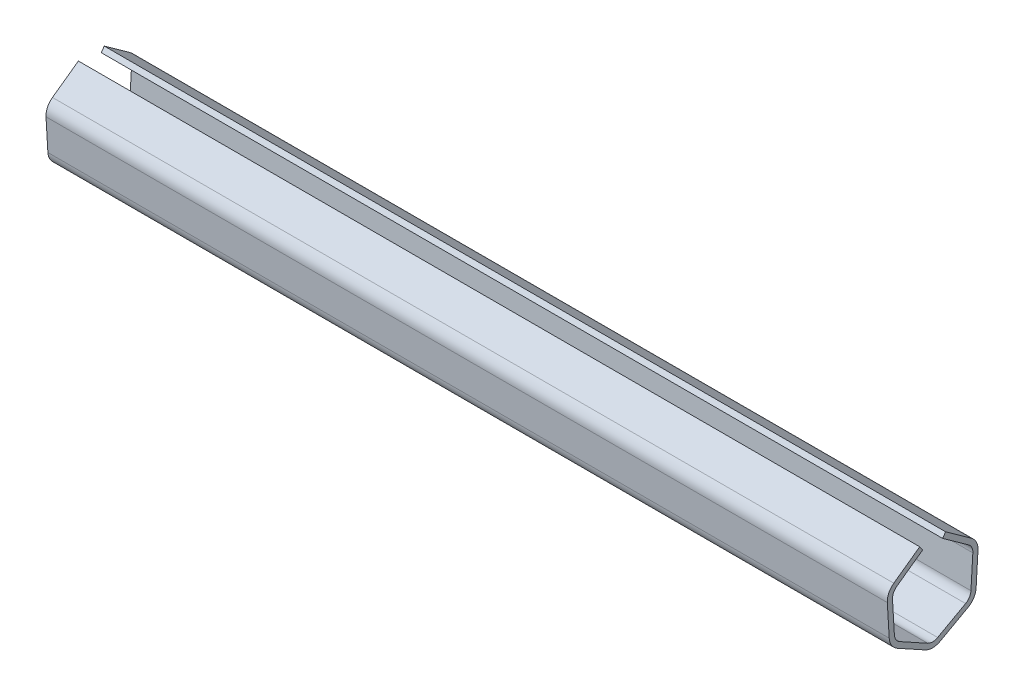
ISO-10303-21;
HEADER;
FILE_DESCRIPTION(('STEP AP214'),'2;1');
FILE_NAME('part.step','',(''),(''),'','','');
FILE_SCHEMA(('AUTOMOTIVE_DESIGN { 1 0 10303 214 1 1 1 1 }'));
ENDSEC;
DATA;
#1=APPLICATION_CONTEXT('core data for automotive mechanical design processes');
#2=APPLICATION_PROTOCOL_DEFINITION('international standard','automotive_design',2000,#1);
#3=PRODUCT_CONTEXT('',#1,'mechanical');
#4=PRODUCT('Part','Part','',(#3));
#5=PRODUCT_RELATED_PRODUCT_CATEGORY('part','',(#4));
#6=PRODUCT_DEFINITION_FORMATION('','',#4);
#7=PRODUCT_DEFINITION_CONTEXT('part definition',#1,'design');
#8=PRODUCT_DEFINITION('design','',#6,#7);
#9=PRODUCT_DEFINITION_SHAPE('','',#8);
#10=(LENGTH_UNIT() NAMED_UNIT(*) SI_UNIT(.MILLI.,.METRE.));
#11=(NAMED_UNIT(*) PLANE_ANGLE_UNIT() SI_UNIT($,.RADIAN.));
#12=(NAMED_UNIT(*) SI_UNIT($,.STERADIAN.) SOLID_ANGLE_UNIT());
#13=UNCERTAINTY_MEASURE_WITH_UNIT(LENGTH_MEASURE(1.E-05),#10,'distance_accuracy_value','');
#14=(GEOMETRIC_REPRESENTATION_CONTEXT(3) GLOBAL_UNCERTAINTY_ASSIGNED_CONTEXT((#13)) GLOBAL_UNIT_ASSIGNED_CONTEXT((#10,
#11,#12)) REPRESENTATION_CONTEXT('',''));
#15=CARTESIAN_POINT('',(0.,0.,0.));
#16=DIRECTION('',(0.,0.,1.));
#17=DIRECTION('',(1.,0.,0.));
#18=AXIS2_PLACEMENT_3D('',#15,#16,#17);
#19=CARTESIAN_POINT('',(325.,22.1288571064017,-30.0339216678259));
#20=DIRECTION('',(0.,-0.812701903756913,0.58267968527304));
#21=DIRECTION('',(0.,-0.582679685273041,-0.812701903756913));
#22=AXIS2_PLACEMENT_3D('',#19,#20,#21);
#23=PLANE('',#22);
#24=DIRECTION('',(0.,0.58267968527304,0.812701903756913));
#25=VECTOR('',#24,1.);
#26=CARTESIAN_POINT('',(-325.,22.1288571064017,-30.0339216678259));
#27=LINE('',#26,#25);
#28=CARTESIAN_POINT('',(-325.,22.1288571064017,-30.0339216678259));
#29=VERTEX_POINT('',#28);
#30=CARTESIAN_POINT('',(-325.,36.4924990742999,-10.));
#31=VERTEX_POINT('',#30);
#32=EDGE_CURVE('E228',#29,#31,#27,.T.);
#33=ORIENTED_EDGE('',*,*,#32,.T.);
#34=DIRECTION('',(-1.,0.,0.));
#35=VECTOR('',#34,1.);
#36=CARTESIAN_POINT('',(325.,36.4924990742999,-10.));
#37=LINE('',#36,#35);
#38=CARTESIAN_POINT('',(325.,36.4924990742999,-10.));
#39=VERTEX_POINT('',#38);
#40=EDGE_CURVE('E11',#39,#31,#37,.T.);
#41=ORIENTED_EDGE('',*,*,#40,.F.);
#42=DIRECTION('',(0.,0.58267968527304,0.812701903756913));
#43=VECTOR('',#42,1.);
#44=CARTESIAN_POINT('',(325.,22.1288571064017,-30.0339216678259));
#45=LINE('',#44,#43);
#46=CARTESIAN_POINT('',(325.,22.1288571064017,-30.0339216678259));
#47=VERTEX_POINT('',#46);
#48=EDGE_CURVE('E141',#47,#39,#45,.T.);
#49=ORIENTED_EDGE('',*,*,#48,.F.);
#50=DIRECTION('',(-1.,0.,0.));
#51=VECTOR('',#50,1.);
#52=CARTESIAN_POINT('',(325.,22.1288571064017,-30.0339216678259));
#53=LINE('',#52,#51);
#54=EDGE_CURVE('E224',#47,#29,#53,.T.);
#55=ORIENTED_EDGE('',*,*,#54,.T.);
#56=EDGE_LOOP('',(#33,#41,#49,#55));
#57=FACE_BOUND('',#56,.T.);
#58=ADVANCED_FACE('F37',(#57),#23,.F.);
#59=CARTESIAN_POINT('',(325.,33.2416914592723,-7.66928125890783));
#60=DIRECTION('',(0.,0.582679685273042,0.812701903756912));
#61=DIRECTION('',(0.,-0.812701903756912,0.582679685273042));
#62=AXIS2_PLACEMENT_3D('',#59,#60,#61);
#63=PLANE('',#62);
#64=DIRECTION('',(0.,0.812701903756912,-0.582679685273042));
#65=VECTOR('',#64,1.);
#66=CARTESIAN_POINT('',(-325.,33.2416914592723,-7.66928125890783));
#67=LINE('',#66,#65);
#68=CARTESIAN_POINT('',(-325.,33.2416914592723,-7.66928125890783));
#69=VERTEX_POINT('',#68);
#70=EDGE_CURVE('E231',#69,#31,#67,.T.);
#71=ORIENTED_EDGE('',*,*,#70,.F.);
#72=DIRECTION('',(-1.,0.,0.));
#73=VECTOR('',#72,1.);
#74=CARTESIAN_POINT('',(325.,33.2416914592723,-7.66928125890783));
#75=LINE('',#74,#73);
#76=CARTESIAN_POINT('',(325.,33.2416914592723,-7.66928125890783));
#77=VERTEX_POINT('',#76);
#78=EDGE_CURVE('E45',#77,#69,#75,.T.);
#79=ORIENTED_EDGE('',*,*,#78,.F.);
#80=DIRECTION('',(0.,0.812701903756912,-0.582679685273042));
#81=VECTOR('',#80,1.);
#82=CARTESIAN_POINT('',(325.,33.2416914592723,-7.66928125890783));
#83=LINE('',#82,#81);
#84=EDGE_CURVE('E357',#77,#39,#83,.T.);
#85=ORIENTED_EDGE('',*,*,#84,.T.);
#86=ORIENTED_EDGE('',*,*,#40,.T.);
#87=EDGE_LOOP('',(#71,#79,#85,#86));
#88=FACE_BOUND('',#87,.T.);
#89=ADVANCED_FACE('F344',(#88),#63,.T.);
#90=CARTESIAN_POINT('',(325.,18.8780494913741,-27.7032029267338));
#91=DIRECTION('',(0.,-0.812701903756913,0.58267968527304));
#92=DIRECTION('',(0.,-0.58267968527304,-0.812701903756913));
#93=AXIS2_PLACEMENT_3D('',#90,#91,#92);
#94=PLANE('',#93);
#95=DIRECTION('',(0.,0.58267968527304,0.812701903756913));
#96=VECTOR('',#95,1.);
#97=CARTESIAN_POINT('',(-325.,18.8780494913741,-27.7032029267338));
#98=LINE('',#97,#96);
#99=CARTESIAN_POINT('',(-325.,18.8780494913741,-27.7032029267338));
#100=VERTEX_POINT('',#99);
#101=EDGE_CURVE('E234',#100,#69,#98,.T.);
#102=ORIENTED_EDGE('',*,*,#101,.F.);
#103=DIRECTION('',(-1.,0.,0.));
#104=VECTOR('',#103,1.);
#105=CARTESIAN_POINT('',(325.,18.8780494913741,-27.7032029267338));
#106=LINE('',#105,#104);
#107=CARTESIAN_POINT('',(325.,18.8780494913741,-27.7032029267338));
#108=VERTEX_POINT('',#107);
#109=EDGE_CURVE('E334',#108,#100,#106,.T.);
#110=ORIENTED_EDGE('',*,*,#109,.F.);
#111=DIRECTION('',(0.,0.58267968527304,0.812701903756913));
#112=VECTOR('',#111,1.);
#113=CARTESIAN_POINT('',(325.,18.8780494913741,-27.7032029267338));
#114=LINE('',#113,#112);
#115=EDGE_CURVE('E341',#108,#77,#114,.T.);
#116=ORIENTED_EDGE('',*,*,#115,.T.);
#117=ORIENTED_EDGE('',*,*,#78,.T.);
#118=EDGE_LOOP('',(#102,#110,#116,#117));
#119=FACE_BOUND('',#118,.T.);
#120=ADVANCED_FACE('F339',(#119),#94,.T.);
#121=CARTESIAN_POINT('',(325.,12.3764342613188,-23.0417654445493));
#122=DIRECTION('',(-1.,0.,0.));
#123=DIRECTION('',(0.,0.,1.));
#124=AXIS2_PLACEMENT_3D('',#121,#122,#123);
#125=CYLINDRICAL_SURFACE('',#124,8.00000000000004);
#126=CARTESIAN_POINT('',(-325.,12.3764342613188,-23.0417654445493));
#127=DIRECTION('',(1.,0.,0.));
#128=DIRECTION('',(0.,0.,-1.));
#129=AXIS2_PLACEMENT_3D('',#126,#127,#128);
#130=CIRCLE('',#129,8.00000000000004);
#131=CARTESIAN_POINT('',(-325.,11.9042770236399,-31.0278200112867));
#132=VERTEX_POINT('',#131);
#133=EDGE_CURVE('E237',#132,#100,#130,.T.);
#134=ORIENTED_EDGE('',*,*,#133,.F.);
#135=DIRECTION('',(-1.,0.,0.));
#136=VECTOR('',#135,1.);
#137=CARTESIAN_POINT('',(325.,11.9042770236399,-31.0278200112867));
#138=LINE('',#137,#136);
#139=CARTESIAN_POINT('',(325.,11.9042770236399,-31.0278200112867));
#140=VERTEX_POINT('',#139);
#141=EDGE_CURVE('E332',#140,#132,#138,.T.);
#142=ORIENTED_EDGE('',*,*,#141,.F.);
#143=CARTESIAN_POINT('',(325.,12.3764342613188,-23.0417654445493));
#144=DIRECTION('',(1.,0.,0.));
#145=DIRECTION('',(0.,0.,-1.));
#146=AXIS2_PLACEMENT_3D('',#143,#144,#145);
#147=CIRCLE('',#146,8.00000000000004);
#148=EDGE_CURVE('E354',#140,#108,#147,.T.);
#149=ORIENTED_EDGE('',*,*,#148,.T.);
#150=ORIENTED_EDGE('',*,*,#109,.T.);
#151=EDGE_LOOP('',(#134,#142,#149,#150));
#152=FACE_BOUND('',#151,.T.);
#153=ADVANCED_FACE('F351',(#152),#125,.F.);
#154=CARTESIAN_POINT('',(325.,-12.7037605122333,-29.5729259919006));
#155=DIRECTION('',(0.,0.0590196547098669,0.998256820842176));
#156=DIRECTION('',(0.,-0.998256820842176,0.0590196547098669));
#157=AXIS2_PLACEMENT_3D('',#154,#155,#156);
#158=PLANE('',#157);
#159=DIRECTION('',(0.,0.998256820842176,-0.0590196547098669));
#160=VECTOR('',#159,1.);
#161=CARTESIAN_POINT('',(-325.,-12.7037605122333,-29.5729259919006));
#162=LINE('',#161,#160);
#163=CARTESIAN_POINT('',(-325.,-12.7037605122333,-29.5729259919006));
#164=VERTEX_POINT('',#163);
#165=EDGE_CURVE('E240',#164,#132,#162,.T.);
#166=ORIENTED_EDGE('',*,*,#165,.F.);
#167=DIRECTION('',(-1.,0.,0.));
#168=VECTOR('',#167,1.);
#169=CARTESIAN_POINT('',(325.,-12.7037605122333,-29.5729259919006));
#170=LINE('',#169,#168);
#171=CARTESIAN_POINT('',(325.,-12.7037605122333,-29.5729259919006));
#172=VERTEX_POINT('',#171);
#173=EDGE_CURVE('E330',#172,#164,#170,.T.);
#174=ORIENTED_EDGE('',*,*,#173,.F.);
#175=DIRECTION('',(0.,0.998256820842176,-0.0590196547098669));
#176=VECTOR('',#175,1.);
#177=CARTESIAN_POINT('',(325.,-12.7037605122333,-29.5729259919006));
#178=LINE('',#177,#176);
#179=EDGE_CURVE('E359',#172,#140,#178,.T.);
#180=ORIENTED_EDGE('',*,*,#179,.T.);
#181=ORIENTED_EDGE('',*,*,#141,.T.);
#182=EDGE_LOOP('',(#166,#174,#180,#181));
#183=FACE_BOUND('',#182,.T.);
#184=ADVANCED_FACE('F435',(#183),#158,.T.);
#185=CARTESIAN_POINT('',(325.,-12.231603274554,-21.5868714251633));
#186=DIRECTION('',(-1.,0.,0.));
#187=DIRECTION('',(0.,0.,1.));
#188=AXIS2_PLACEMENT_3D('',#185,#186,#187);
#189=CYLINDRICAL_SURFACE('',#188,7.99999999999995);
#190=CARTESIAN_POINT('',(-325.,-12.231603274554,-21.5868714251633));
#191=DIRECTION('',(1.,0.,0.));
#192=DIRECTION('',(0.,0.,-1.));
#193=AXIS2_PLACEMENT_3D('',#190,#191,#192);
#194=CIRCLE('',#193,7.99999999999995);
#195=CARTESIAN_POINT('',(-325.,-19.2371978033818,-25.4497259781664));
#196=VERTEX_POINT('',#195);
#197=EDGE_CURVE('E243',#196,#164,#194,.T.);
#198=ORIENTED_EDGE('',*,*,#197,.F.);
#199=DIRECTION('',(-1.,0.,0.));
#200=VECTOR('',#199,1.);
#201=CARTESIAN_POINT('',(325.,-19.2371978033818,-25.4497259781664));
#202=LINE('',#201,#200);
#203=CARTESIAN_POINT('',(325.,-19.2371978033818,-25.4497259781664));
#204=VERTEX_POINT('',#203);
#205=EDGE_CURVE('E328',#204,#196,#202,.T.);
#206=ORIENTED_EDGE('',*,*,#205,.F.);
#207=CARTESIAN_POINT('',(325.,-12.231603274554,-21.5868714251633));
#208=DIRECTION('',(1.,0.,0.));
#209=DIRECTION('',(0.,0.,-1.));
#210=AXIS2_PLACEMENT_3D('',#207,#208,#209);
#211=CIRCLE('',#210,7.99999999999995);
#212=EDGE_CURVE('E365',#204,#172,#211,.T.);
#213=ORIENTED_EDGE('',*,*,#212,.T.);
#214=ORIENTED_EDGE('',*,*,#173,.T.);
#215=EDGE_LOOP('',(#198,#206,#213,#214));
#216=FACE_BOUND('',#215,.T.);
#217=ADVANCED_FACE('F438',(#216),#189,.F.);
#218=CARTESIAN_POINT('',(325.,-31.1401054333697,-3.86285455300323));
#219=DIRECTION('',(0.,0.875699316103479,0.4828568191254));
#220=DIRECTION('',(0.,-0.4828568191254,0.875699316103479));
#221=AXIS2_PLACEMENT_3D('',#218,#219,#220);
#222=PLANE('',#221);
#223=DIRECTION('',(0.,0.4828568191254,-0.875699316103479));
#224=VECTOR('',#223,1.);
#225=CARTESIAN_POINT('',(-325.,-31.1401054333697,-3.86285455300323));
#226=LINE('',#225,#224);
#227=CARTESIAN_POINT('',(-325.,-31.1401054333697,-3.86285455300324));
#228=VERTEX_POINT('',#227);
#229=EDGE_CURVE('E246',#228,#196,#226,.T.);
#230=ORIENTED_EDGE('',*,*,#229,.F.);
#231=DIRECTION('',(-1.,0.,0.));
#232=VECTOR('',#231,1.);
#233=CARTESIAN_POINT('',(325.,-31.1401054333697,-3.86285455300324));
#234=LINE('',#233,#232);
#235=CARTESIAN_POINT('',(325.,-31.1401054333697,-3.86285455300324));
#236=VERTEX_POINT('',#235);
#237=EDGE_CURVE('E326',#236,#228,#234,.T.);
#238=ORIENTED_EDGE('',*,*,#237,.F.);
#239=DIRECTION('',(0.,0.4828568191254,-0.875699316103479));
#240=VECTOR('',#239,1.);
#241=CARTESIAN_POINT('',(325.,-31.1401054333697,-3.86285455300323));
#242=LINE('',#241,#240);
#243=EDGE_CURVE('E368',#236,#204,#242,.T.);
#244=ORIENTED_EDGE('',*,*,#243,.T.);
#245=ORIENTED_EDGE('',*,*,#205,.T.);
#246=EDGE_LOOP('',(#230,#238,#244,#245));
#247=FACE_BOUND('',#246,.T.);
#248=ADVANCED_FACE('F442',(#247),#222,.T.);
#249=CARTESIAN_POINT('',(325.,-24.1345109045418,0.));
#250=DIRECTION('',(-1.,0.,0.));
#251=DIRECTION('',(0.,0.,1.));
#252=AXIS2_PLACEMENT_3D('',#249,#250,#251);
#253=CYLINDRICAL_SURFACE('',#252,8.00000000000005);
#254=CARTESIAN_POINT('',(-325.,-24.1345109045418,0.));
#255=DIRECTION('',(1.,0.,0.));
#256=DIRECTION('',(0.,0.,-1.));
#257=AXIS2_PLACEMENT_3D('',#254,#255,#256);
#258=CIRCLE('',#257,8.00000000000005);
#259=CARTESIAN_POINT('',(-325.,-31.1401054333697,3.86285455300324));
#260=VERTEX_POINT('',#259);
#261=EDGE_CURVE('E249',#260,#228,#258,.T.);
#262=ORIENTED_EDGE('',*,*,#261,.F.);
#263=DIRECTION('',(-1.,0.,0.));
#264=VECTOR('',#263,1.);
#265=CARTESIAN_POINT('',(325.,-31.1401054333697,3.86285455300324));
#266=LINE('',#265,#264);
#267=CARTESIAN_POINT('',(325.,-31.1401054333697,3.86285455300324));
#268=VERTEX_POINT('',#267);
#269=EDGE_CURVE('E324',#268,#260,#266,.T.);
#270=ORIENTED_EDGE('',*,*,#269,.F.);
#271=CARTESIAN_POINT('',(325.,-24.1345109045418,0.));
#272=DIRECTION('',(1.,0.,0.));
#273=DIRECTION('',(0.,0.,-1.));
#274=AXIS2_PLACEMENT_3D('',#271,#272,#273);
#275=CIRCLE('',#274,8.00000000000005);
#276=EDGE_CURVE('E371',#268,#236,#275,.T.);
#277=ORIENTED_EDGE('',*,*,#276,.T.);
#278=ORIENTED_EDGE('',*,*,#237,.T.);
#279=EDGE_LOOP('',(#262,#270,#277,#278));
#280=FACE_BOUND('',#279,.T.);
#281=ADVANCED_FACE('F446',(#280),#253,.F.);
#282=CARTESIAN_POINT('',(325.,-31.1401054333697,3.86285455300323));
#283=DIRECTION('',(0.,0.875699316103479,-0.4828568191254));
#284=DIRECTION('',(0.,0.4828568191254,0.875699316103479));
#285=AXIS2_PLACEMENT_3D('',#282,#283,#284);
#286=PLANE('',#285);
#287=DIRECTION('',(0.,-0.4828568191254,-0.875699316103479));
#288=VECTOR('',#287,1.);
#289=CARTESIAN_POINT('',(-325.,-31.1401054333697,3.86285455300323));
#290=LINE('',#289,#288);
#291=CARTESIAN_POINT('',(-325.,-19.2371978033818,25.4497259781665));
#292=VERTEX_POINT('',#291);
#293=EDGE_CURVE('E252',#292,#260,#290,.T.);
#294=ORIENTED_EDGE('',*,*,#293,.F.);
#295=DIRECTION('',(-1.,0.,0.));
#296=VECTOR('',#295,1.);
#297=CARTESIAN_POINT('',(325.,-19.2371978033818,25.4497259781665));
#298=LINE('',#297,#296);
#299=CARTESIAN_POINT('',(325.,-19.2371978033818,25.4497259781665));
#300=VERTEX_POINT('',#299);
#301=EDGE_CURVE('E322',#300,#292,#298,.T.);
#302=ORIENTED_EDGE('',*,*,#301,.F.);
#303=DIRECTION('',(0.,-0.4828568191254,-0.875699316103479));
#304=VECTOR('',#303,1.);
#305=CARTESIAN_POINT('',(325.,-31.1401054333697,3.86285455300323));
#306=LINE('',#305,#304);
#307=EDGE_CURVE('E374',#300,#268,#306,.T.);
#308=ORIENTED_EDGE('',*,*,#307,.T.);
#309=ORIENTED_EDGE('',*,*,#269,.T.);
#310=EDGE_LOOP('',(#294,#302,#308,#309));
#311=FACE_BOUND('',#310,.T.);
#312=ADVANCED_FACE('F450',(#311),#286,.T.);
#313=CARTESIAN_POINT('',(325.,-12.231603274554,21.5868714251633));
#314=DIRECTION('',(-1.,0.,0.));
#315=DIRECTION('',(0.,0.,1.));
#316=AXIS2_PLACEMENT_3D('',#313,#314,#315);
#317=CYLINDRICAL_SURFACE('',#316,7.99999999999995);
#318=CARTESIAN_POINT('',(-325.,-12.231603274554,21.5868714251633));
#319=DIRECTION('',(1.,0.,0.));
#320=DIRECTION('',(0.,0.,-1.));
#321=AXIS2_PLACEMENT_3D('',#318,#319,#320);
#322=CIRCLE('',#321,7.99999999999995);
#323=CARTESIAN_POINT('',(-325.,-12.7037605122332,29.5729259919006));
#324=VERTEX_POINT('',#323);
#325=EDGE_CURVE('E255',#324,#292,#322,.T.);
#326=ORIENTED_EDGE('',*,*,#325,.F.);
#327=DIRECTION('',(-1.,0.,0.));
#328=VECTOR('',#327,1.);
#329=CARTESIAN_POINT('',(325.,-12.7037605122332,29.5729259919006));
#330=LINE('',#329,#328);
#331=CARTESIAN_POINT('',(325.,-12.7037605122332,29.5729259919006));
#332=VERTEX_POINT('',#331);
#333=EDGE_CURVE('E320',#332,#324,#330,.T.);
#334=ORIENTED_EDGE('',*,*,#333,.F.);
#335=CARTESIAN_POINT('',(325.,-12.231603274554,21.5868714251633));
#336=DIRECTION('',(1.,0.,0.));
#337=DIRECTION('',(0.,0.,-1.));
#338=AXIS2_PLACEMENT_3D('',#335,#336,#337);
#339=CIRCLE('',#338,7.99999999999995);
#340=EDGE_CURVE('E377',#332,#300,#339,.T.);
#341=ORIENTED_EDGE('',*,*,#340,.T.);
#342=ORIENTED_EDGE('',*,*,#301,.T.);
#343=EDGE_LOOP('',(#326,#334,#341,#342));
#344=FACE_BOUND('',#343,.T.);
#345=ADVANCED_FACE('F454',(#344),#317,.F.);
#346=CARTESIAN_POINT('',(325.,-12.7037605122333,29.5729259919006));
#347=DIRECTION('',(0.,0.0590196547098669,-0.998256820842176));
#348=DIRECTION('',(0.,0.998256820842176,0.0590196547098669));
#349=AXIS2_PLACEMENT_3D('',#346,#347,#348);
#350=PLANE('',#349);
#351=DIRECTION('',(0.,-0.998256820842176,-0.0590196547098669));
#352=VECTOR('',#351,1.);
#353=CARTESIAN_POINT('',(-325.,-12.7037605122333,29.5729259919006));
#354=LINE('',#353,#352);
#355=CARTESIAN_POINT('',(-325.,11.9042770236399,31.0278200112867));
#356=VERTEX_POINT('',#355);
#357=EDGE_CURVE('E258',#356,#324,#354,.T.);
#358=ORIENTED_EDGE('',*,*,#357,.F.);
#359=DIRECTION('',(-1.,0.,0.));
#360=VECTOR('',#359,1.);
#361=CARTESIAN_POINT('',(325.,11.9042770236399,31.0278200112867));
#362=LINE('',#361,#360);
#363=CARTESIAN_POINT('',(325.,11.9042770236399,31.0278200112867));
#364=VERTEX_POINT('',#363);
#365=EDGE_CURVE('E317',#364,#356,#362,.T.);
#366=ORIENTED_EDGE('',*,*,#365,.F.);
#367=DIRECTION('',(0.,-0.998256820842176,-0.0590196547098669));
#368=VECTOR('',#367,1.);
#369=CARTESIAN_POINT('',(325.,-12.7037605122333,29.5729259919006));
#370=LINE('',#369,#368);
#371=EDGE_CURVE('E380',#364,#332,#370,.T.);
#372=ORIENTED_EDGE('',*,*,#371,.T.);
#373=ORIENTED_EDGE('',*,*,#333,.T.);
#374=EDGE_LOOP('',(#358,#366,#372,#373));
#375=FACE_BOUND('',#374,.T.);
#376=ADVANCED_FACE('F458',(#375),#350,.T.);
#377=CARTESIAN_POINT('',(325.,12.3764342613186,23.0417654445493));
#378=DIRECTION('',(-1.,0.,0.));
#379=DIRECTION('',(0.,0.,1.));
#380=AXIS2_PLACEMENT_3D('',#377,#378,#379);
#381=CYLINDRICAL_SURFACE('',#380,8.00000000000014);
#382=CARTESIAN_POINT('',(-325.,12.3764342613186,23.0417654445493));
#383=DIRECTION('',(1.,0.,0.));
#384=DIRECTION('',(0.,0.,-1.));
#385=AXIS2_PLACEMENT_3D('',#382,#383,#384);
#386=CIRCLE('',#385,8.00000000000014);
#387=CARTESIAN_POINT('',(-325.,18.878049491374,27.7032029267337));
#388=VERTEX_POINT('',#387);
#389=EDGE_CURVE('E261',#388,#356,#386,.T.);
#390=ORIENTED_EDGE('',*,*,#389,.F.);
#391=DIRECTION('',(-1.,0.,0.));
#392=VECTOR('',#391,1.);
#393=CARTESIAN_POINT('',(325.,18.878049491374,27.7032029267337));
#394=LINE('',#393,#392);
#395=CARTESIAN_POINT('',(325.,18.878049491374,27.7032029267337));
#396=VERTEX_POINT('',#395);
#397=EDGE_CURVE('E314',#396,#388,#394,.T.);
#398=ORIENTED_EDGE('',*,*,#397,.F.);
#399=CARTESIAN_POINT('',(325.,12.3764342613186,23.0417654445493));
#400=DIRECTION('',(1.,0.,0.));
#401=DIRECTION('',(0.,0.,-1.));
#402=AXIS2_PLACEMENT_3D('',#399,#400,#401);
#403=CIRCLE('',#402,8.00000000000014);
#404=EDGE_CURVE('E383',#396,#364,#403,.T.);
#405=ORIENTED_EDGE('',*,*,#404,.T.);
#406=ORIENTED_EDGE('',*,*,#365,.T.);
#407=EDGE_LOOP('',(#390,#398,#405,#406));
#408=FACE_BOUND('',#407,.T.);
#409=ADVANCED_FACE('F462',(#408),#381,.F.);
#410=CARTESIAN_POINT('',(325.,18.8780494913741,27.7032029267338));
#411=DIRECTION('',(0.,-0.812701903756913,-0.58267968527304));
#412=DIRECTION('',(0.,0.58267968527304,-0.812701903756913));
#413=AXIS2_PLACEMENT_3D('',#410,#411,#412);
#414=PLANE('',#413);
#415=DIRECTION('',(0.,-0.58267968527304,0.812701903756913));
#416=VECTOR('',#415,1.);
#417=CARTESIAN_POINT('',(-325.,18.8780494913741,27.7032029267338));
#418=LINE('',#417,#416);
#419=CARTESIAN_POINT('',(-325.,33.2416914592723,7.66928125890783));
#420=VERTEX_POINT('',#419);
#421=EDGE_CURVE('E264',#420,#388,#418,.T.);
#422=ORIENTED_EDGE('',*,*,#421,.F.);
#423=DIRECTION('',(-1.,0.,0.));
#424=VECTOR('',#423,1.);
#425=CARTESIAN_POINT('',(325.,33.2416914592723,7.66928125890783));
#426=LINE('',#425,#424);
#427=CARTESIAN_POINT('',(325.,33.2416914592723,7.66928125890783));
#428=VERTEX_POINT('',#427);
#429=EDGE_CURVE('E312',#428,#420,#426,.T.);
#430=ORIENTED_EDGE('',*,*,#429,.F.);
#431=DIRECTION('',(0.,-0.58267968527304,0.812701903756913));
#432=VECTOR('',#431,1.);
#433=CARTESIAN_POINT('',(325.,18.8780494913741,27.7032029267338));
#434=LINE('',#433,#432);
#435=EDGE_CURVE('E386',#428,#396,#434,.T.);
#436=ORIENTED_EDGE('',*,*,#435,.T.);
#437=ORIENTED_EDGE('',*,*,#397,.T.);
#438=EDGE_LOOP('',(#422,#430,#436,#437));
#439=FACE_BOUND('',#438,.T.);
#440=ADVANCED_FACE('F466',(#439),#414,.T.);
#441=CARTESIAN_POINT('',(325.,36.4924990742999,10.));
#442=DIRECTION('',(0.,0.582679685273042,-0.812701903756912));
#443=DIRECTION('',(0.,0.812701903756912,0.582679685273042));
#444=AXIS2_PLACEMENT_3D('',#441,#442,#443);
#445=PLANE('',#444);
#446=DIRECTION('',(0.,-0.812701903756912,-0.582679685273042));
#447=VECTOR('',#446,1.);
#448=CARTESIAN_POINT('',(-325.,36.4924990742999,10.));
#449=LINE('',#448,#447);
#450=CARTESIAN_POINT('',(-325.,36.4924990742999,10.));
#451=VERTEX_POINT('',#450);
#452=EDGE_CURVE('E267',#451,#420,#449,.T.);
#453=ORIENTED_EDGE('',*,*,#452,.F.);
#454=DIRECTION('',(-1.,0.,0.));
#455=VECTOR('',#454,1.);
#456=CARTESIAN_POINT('',(325.,36.4924990742999,10.));
#457=LINE('',#456,#455);
#458=CARTESIAN_POINT('',(325.,36.4924990742999,10.));
#459=VERTEX_POINT('',#458);
#460=EDGE_CURVE('E310',#459,#451,#457,.T.);
#461=ORIENTED_EDGE('',*,*,#460,.F.);
#462=DIRECTION('',(0.,-0.812701903756912,-0.582679685273042));
#463=VECTOR('',#462,1.);
#464=CARTESIAN_POINT('',(325.,36.4924990742999,10.));
#465=LINE('',#464,#463);
#466=EDGE_CURVE('E389',#459,#428,#465,.T.);
#467=ORIENTED_EDGE('',*,*,#466,.T.);
#468=ORIENTED_EDGE('',*,*,#429,.T.);
#469=EDGE_LOOP('',(#453,#461,#467,#468));
#470=FACE_BOUND('',#469,.T.);
#471=ADVANCED_FACE('F470',(#470),#445,.T.);
#472=CARTESIAN_POINT('',(325.,22.1288571064017,30.0339216678259));
#473=DIRECTION('',(0.,-0.812701903756913,-0.58267968527304));
#474=DIRECTION('',(0.,0.582679685273041,-0.812701903756913));
#475=AXIS2_PLACEMENT_3D('',#472,#473,#474);
#476=PLANE('',#475);
#477=DIRECTION('',(0.,-0.58267968527304,0.812701903756913));
#478=VECTOR('',#477,1.);
#479=CARTESIAN_POINT('',(-325.,22.1288571064017,30.0339216678259));
#480=LINE('',#479,#478);
#481=CARTESIAN_POINT('',(-325.,22.1288571064017,30.0339216678259));
#482=VERTEX_POINT('',#481);
#483=EDGE_CURVE('E270',#451,#482,#480,.T.);
#484=ORIENTED_EDGE('',*,*,#483,.T.);
#485=DIRECTION('',(-1.,0.,0.));
#486=VECTOR('',#485,1.);
#487=CARTESIAN_POINT('',(325.,22.1288571064017,30.0339216678259));
#488=LINE('',#487,#486);
#489=CARTESIAN_POINT('',(325.,22.1288571064017,30.0339216678259));
#490=VERTEX_POINT('',#489);
#491=EDGE_CURVE('E306',#490,#482,#488,.T.);
#492=ORIENTED_EDGE('',*,*,#491,.F.);
#493=DIRECTION('',(0.,-0.58267968527304,0.812701903756913));
#494=VECTOR('',#493,1.);
#495=CARTESIAN_POINT('',(325.,22.1288571064017,30.0339216678259));
#496=LINE('',#495,#494);
#497=EDGE_CURVE('E392',#459,#490,#496,.T.);
#498=ORIENTED_EDGE('',*,*,#497,.F.);
#499=ORIENTED_EDGE('',*,*,#460,.T.);
#500=EDGE_LOOP('',(#484,#492,#498,#499));
#501=FACE_BOUND('',#500,.T.);
#502=ADVANCED_FACE('F474',(#501),#476,.F.);
#503=CARTESIAN_POINT('',(325.,12.3764342613186,23.0417654445493));
#504=DIRECTION('',(-1.,0.,0.));
#505=DIRECTION('',(0.,0.,1.));
#506=AXIS2_PLACEMENT_3D('',#503,#504,#505);
#507=CYLINDRICAL_SURFACE('',#506,12.0000000000001);
#508=CARTESIAN_POINT('',(-325.,12.3764342613186,23.0417654445493));
#509=DIRECTION('',(1.,0.,0.));
#510=DIRECTION('',(0.,0.,1.));
#511=AXIS2_PLACEMENT_3D('',#508,#509,#510);
#512=CIRCLE('',#511,12.0000000000001);
#513=CARTESIAN_POINT('',(-325.,11.6681984048004,35.0208472946555));
#514=VERTEX_POINT('',#513);
#515=EDGE_CURVE('E272',#482,#514,#512,.T.);
#516=ORIENTED_EDGE('',*,*,#515,.T.);
#517=DIRECTION('',(-1.,0.,0.));
#518=VECTOR('',#517,1.);
#519=CARTESIAN_POINT('',(325.,11.6681984048004,35.0208472946555));
#520=LINE('',#519,#518);
#521=CARTESIAN_POINT('',(325.,11.6681984048004,35.0208472946555));
#522=VERTEX_POINT('',#521);
#523=EDGE_CURVE('E303',#522,#514,#520,.T.);
#524=ORIENTED_EDGE('',*,*,#523,.F.);
#525=CARTESIAN_POINT('',(325.,12.3764342613186,23.0417654445493));
#526=DIRECTION('',(1.,0.,0.));
#527=DIRECTION('',(0.,0.,1.));
#528=AXIS2_PLACEMENT_3D('',#525,#526,#527);
#529=CIRCLE('',#528,12.0000000000001);
#530=EDGE_CURVE('E394',#490,#522,#529,.T.);
#531=ORIENTED_EDGE('',*,*,#530,.F.);
#532=ORIENTED_EDGE('',*,*,#491,.T.);
#533=EDGE_LOOP('',(#516,#524,#531,#532));
#534=FACE_BOUND('',#533,.T.);
#535=ADVANCED_FACE('F478',(#534),#507,.T.);
#536=CARTESIAN_POINT('',(325.,-12.9398391310728,33.5659532752693));
#537=DIRECTION('',(0.,0.0590196547098669,-0.998256820842176));
#538=DIRECTION('',(0.,0.998256820842176,0.0590196547098669));
#539=AXIS2_PLACEMENT_3D('',#536,#537,#538);
#540=PLANE('',#539);
#541=DIRECTION('',(0.,-0.998256820842176,-0.0590196547098669));
#542=VECTOR('',#541,1.);
#543=CARTESIAN_POINT('',(-325.,-12.9398391310728,33.5659532752693));
#544=LINE('',#543,#542);
#545=CARTESIAN_POINT('',(-325.,-12.9398391310728,33.5659532752693));
#546=VERTEX_POINT('',#545);
#547=EDGE_CURVE('E274',#514,#546,#544,.T.);
#548=ORIENTED_EDGE('',*,*,#547,.T.);
#549=DIRECTION('',(-1.,0.,0.));
#550=VECTOR('',#549,1.);
#551=CARTESIAN_POINT('',(325.,-12.9398391310728,33.5659532752693));
#552=LINE('',#551,#550);
#553=CARTESIAN_POINT('',(325.,-12.9398391310728,33.5659532752693));
#554=VERTEX_POINT('',#553);
#555=EDGE_CURVE('E300',#554,#546,#552,.T.);
#556=ORIENTED_EDGE('',*,*,#555,.F.);
#557=DIRECTION('',(0.,-0.998256820842176,-0.0590196547098669));
#558=VECTOR('',#557,1.);
#559=CARTESIAN_POINT('',(325.,-12.9398391310728,33.5659532752693));
#560=LINE('',#559,#558);
#561=EDGE_CURVE('E396',#522,#554,#560,.T.);
#562=ORIENTED_EDGE('',*,*,#561,.F.);
#563=ORIENTED_EDGE('',*,*,#523,.T.);
#564=EDGE_LOOP('',(#548,#556,#562,#563));
#565=FACE_BOUND('',#564,.T.);
#566=ADVANCED_FACE('F482',(#565),#540,.F.);
#567=CARTESIAN_POINT('',(325.,-12.231603274554,21.5868714251633));
#568=DIRECTION('',(-1.,0.,0.));
#569=DIRECTION('',(0.,0.,1.));
#570=AXIS2_PLACEMENT_3D('',#567,#568,#569);
#571=CYLINDRICAL_SURFACE('',#570,12.);
#572=CARTESIAN_POINT('',(-325.,-12.231603274554,21.5868714251633));
#573=DIRECTION('',(1.,0.,0.));
#574=DIRECTION('',(0.,0.,1.));
#575=AXIS2_PLACEMENT_3D('',#572,#573,#574);
#576=CIRCLE('',#575,12.);
#577=CARTESIAN_POINT('',(-325.,-22.7399950677957,27.381153254668));
#578=VERTEX_POINT('',#577);
#579=EDGE_CURVE('E276',#546,#578,#576,.T.);
#580=ORIENTED_EDGE('',*,*,#579,.T.);
#581=DIRECTION('',(-1.,0.,0.));
#582=VECTOR('',#581,1.);
#583=CARTESIAN_POINT('',(325.,-22.7399950677957,27.381153254668));
#584=LINE('',#583,#582);
#585=CARTESIAN_POINT('',(325.,-22.7399950677957,27.381153254668));
#586=VERTEX_POINT('',#585);
#587=EDGE_CURVE('E297',#586,#578,#584,.T.);
#588=ORIENTED_EDGE('',*,*,#587,.F.);
#589=CARTESIAN_POINT('',(325.,-12.231603274554,21.5868714251633));
#590=DIRECTION('',(1.,0.,0.));
#591=DIRECTION('',(0.,0.,1.));
#592=AXIS2_PLACEMENT_3D('',#589,#590,#591);
#593=CIRCLE('',#592,12.);
#594=EDGE_CURVE('E398',#554,#586,#593,.T.);
#595=ORIENTED_EDGE('',*,*,#594,.F.);
#596=ORIENTED_EDGE('',*,*,#555,.T.);
#597=EDGE_LOOP('',(#580,#588,#595,#596));
#598=FACE_BOUND('',#597,.T.);
#599=ADVANCED_FACE('F486',(#598),#571,.T.);
#600=CARTESIAN_POINT('',(325.,-34.6429026977836,5.79428182950483));
#601=DIRECTION('',(0.,0.875699316103479,-0.482856819125399));
#602=DIRECTION('',(0.,0.4828568191254,0.875699316103479));
#603=AXIS2_PLACEMENT_3D('',#600,#601,#602);
#604=PLANE('',#603);
#605=DIRECTION('',(0.,-0.4828568191254,-0.875699316103479));
#606=VECTOR('',#605,1.);
#607=CARTESIAN_POINT('',(-325.,-34.6429026977836,5.79428182950483));
#608=LINE('',#607,#606);
#609=CARTESIAN_POINT('',(-325.,-34.6429026977836,5.79428182950483));
#610=VERTEX_POINT('',#609);
#611=EDGE_CURVE('E278',#578,#610,#608,.T.);
#612=ORIENTED_EDGE('',*,*,#611,.T.);
#613=DIRECTION('',(-1.,0.,0.));
#614=VECTOR('',#613,1.);
#615=CARTESIAN_POINT('',(325.,-34.6429026977836,5.79428182950483));
#616=LINE('',#615,#614);
#617=CARTESIAN_POINT('',(325.,-34.6429026977836,5.79428182950483));
#618=VERTEX_POINT('',#617);
#619=EDGE_CURVE('E294',#618,#610,#616,.T.);
#620=ORIENTED_EDGE('',*,*,#619,.F.);
#621=DIRECTION('',(0.,-0.4828568191254,-0.875699316103479));
#622=VECTOR('',#621,1.);
#623=CARTESIAN_POINT('',(325.,-34.6429026977836,5.79428182950483));
#624=LINE('',#623,#622);
#625=EDGE_CURVE('E400',#586,#618,#624,.T.);
#626=ORIENTED_EDGE('',*,*,#625,.F.);
#627=ORIENTED_EDGE('',*,*,#587,.T.);
#628=EDGE_LOOP('',(#612,#620,#626,#627));
#629=FACE_BOUND('',#628,.T.);
#630=ADVANCED_FACE('F490',(#629),#604,.F.);
#631=CARTESIAN_POINT('',(325.,-24.1345109045418,0.));
#632=DIRECTION('',(-1.,0.,0.));
#633=DIRECTION('',(0.,0.,1.));
#634=AXIS2_PLACEMENT_3D('',#631,#632,#633);
#635=CYLINDRICAL_SURFACE('',#634,12.);
#636=CARTESIAN_POINT('',(-325.,-24.1345109045418,0.));
#637=DIRECTION('',(1.,0.,0.));
#638=DIRECTION('',(0.,0.,1.));
#639=AXIS2_PLACEMENT_3D('',#636,#637,#638);
#640=CIRCLE('',#639,12.);
#641=CARTESIAN_POINT('',(-325.,-34.6429026977836,-5.79428182950483));
#642=VERTEX_POINT('',#641);
#643=EDGE_CURVE('E280',#610,#642,#640,.T.);
#644=ORIENTED_EDGE('',*,*,#643,.T.);
#645=DIRECTION('',(-1.,0.,0.));
#646=VECTOR('',#645,1.);
#647=CARTESIAN_POINT('',(325.,-34.6429026977836,-5.79428182950483));
#648=LINE('',#647,#646);
#649=CARTESIAN_POINT('',(325.,-34.6429026977836,-5.79428182950483));
#650=VERTEX_POINT('',#649);
#651=EDGE_CURVE('E291',#650,#642,#648,.T.);
#652=ORIENTED_EDGE('',*,*,#651,.F.);
#653=CARTESIAN_POINT('',(325.,-24.1345109045418,0.));
#654=DIRECTION('',(1.,0.,0.));
#655=DIRECTION('',(0.,0.,1.));
#656=AXIS2_PLACEMENT_3D('',#653,#654,#655);
#657=CIRCLE('',#656,12.);
#658=EDGE_CURVE('E402',#618,#650,#657,.T.);
#659=ORIENTED_EDGE('',*,*,#658,.F.);
#660=ORIENTED_EDGE('',*,*,#619,.T.);
#661=EDGE_LOOP('',(#644,#652,#659,#660));
#662=FACE_BOUND('',#661,.T.);
#663=ADVANCED_FACE('F408',(#662),#635,.T.);
#664=CARTESIAN_POINT('',(325.,-34.6429026977836,-5.79428182950483));
#665=DIRECTION('',(0.,0.875699316103479,0.482856819125399));
#666=DIRECTION('',(0.,-0.4828568191254,0.875699316103479));
#667=AXIS2_PLACEMENT_3D('',#664,#665,#666);
#668=PLANE('',#667);
#669=DIRECTION('',(0.,0.4828568191254,-0.875699316103479));
#670=VECTOR('',#669,1.);
#671=CARTESIAN_POINT('',(-325.,-34.6429026977836,-5.79428182950483));
#672=LINE('',#671,#670);
#673=CARTESIAN_POINT('',(-325.,-22.7399950677957,-27.3811532546681));
#674=VERTEX_POINT('',#673);
#675=EDGE_CURVE('E282',#642,#674,#672,.T.);
#676=ORIENTED_EDGE('',*,*,#675,.T.);
#677=DIRECTION('',(-1.,0.,0.));
#678=VECTOR('',#677,1.);
#679=CARTESIAN_POINT('',(325.,-22.7399950677957,-27.3811532546681));
#680=LINE('',#679,#678);
#681=CARTESIAN_POINT('',(325.,-22.7399950677957,-27.3811532546681));
#682=VERTEX_POINT('',#681);
#683=EDGE_CURVE('E219',#682,#674,#680,.T.);
#684=ORIENTED_EDGE('',*,*,#683,.F.);
#685=DIRECTION('',(0.,0.4828568191254,-0.875699316103479));
#686=VECTOR('',#685,1.);
#687=CARTESIAN_POINT('',(325.,-34.6429026977836,-5.79428182950483));
#688=LINE('',#687,#686);
#689=EDGE_CURVE('E210',#650,#682,#688,.T.);
#690=ORIENTED_EDGE('',*,*,#689,.F.);
#691=ORIENTED_EDGE('',*,*,#651,.T.);
#692=EDGE_LOOP('',(#676,#684,#690,#691));
#693=FACE_BOUND('',#692,.T.);
#694=ADVANCED_FACE('F412',(#693),#668,.F.);
#695=CARTESIAN_POINT('',(325.,-12.231603274554,-21.5868714251633));
#696=DIRECTION('',(-1.,0.,0.));
#697=DIRECTION('',(0.,0.,1.));
#698=AXIS2_PLACEMENT_3D('',#695,#696,#697);
#699=CYLINDRICAL_SURFACE('',#698,12.);
#700=CARTESIAN_POINT('',(-325.,-12.231603274554,-21.5868714251633));
#701=DIRECTION('',(1.,0.,0.));
#702=DIRECTION('',(0.,0.,1.));
#703=AXIS2_PLACEMENT_3D('',#700,#701,#702);
#704=CIRCLE('',#703,12.);
#705=CARTESIAN_POINT('',(-325.,-12.9398391310728,-33.5659532752693));
#706=VERTEX_POINT('',#705);
#707=EDGE_CURVE('E218',#674,#706,#704,.T.);
#708=ORIENTED_EDGE('',*,*,#707,.T.);
#709=DIRECTION('',(-1.,0.,0.));
#710=VECTOR('',#709,1.);
#711=CARTESIAN_POINT('',(325.,-12.9398391310728,-33.5659532752693));
#712=LINE('',#711,#710);
#713=CARTESIAN_POINT('',(325.,-12.9398391310728,-33.5659532752693));
#714=VERTEX_POINT('',#713);
#715=EDGE_CURVE('E215',#714,#706,#712,.T.);
#716=ORIENTED_EDGE('',*,*,#715,.F.);
#717=CARTESIAN_POINT('',(325.,-12.231603274554,-21.5868714251633));
#718=DIRECTION('',(1.,0.,0.));
#719=DIRECTION('',(0.,0.,1.));
#720=AXIS2_PLACEMENT_3D('',#717,#718,#719);
#721=CIRCLE('',#720,12.);
#722=EDGE_CURVE('E204',#682,#714,#721,.T.);
#723=ORIENTED_EDGE('',*,*,#722,.F.);
#724=ORIENTED_EDGE('',*,*,#683,.T.);
#725=EDGE_LOOP('',(#708,#716,#723,#724));
#726=FACE_BOUND('',#725,.T.);
#727=ADVANCED_FACE('F216',(#726),#699,.T.);
#728=CARTESIAN_POINT('',(325.,-12.9398391310728,-33.5659532752693));
#729=DIRECTION('',(0.,0.0590196547098669,0.998256820842176));
#730=DIRECTION('',(0.,-0.998256820842176,0.0590196547098669));
#731=AXIS2_PLACEMENT_3D('',#728,#729,#730);
#732=PLANE('',#731);
#733=DIRECTION('',(0.,0.998256820842176,-0.0590196547098669));
#734=VECTOR('',#733,1.);
#735=CARTESIAN_POINT('',(-325.,-12.9398391310728,-33.5659532752693));
#736=LINE('',#735,#734);
#737=CARTESIAN_POINT('',(-325.,11.6681984048004,-35.0208472946554));
#738=VERTEX_POINT('',#737);
#739=EDGE_CURVE('E129',#706,#738,#736,.T.);
#740=ORIENTED_EDGE('',*,*,#739,.T.);
#741=DIRECTION('',(-1.,0.,0.));
#742=VECTOR('',#741,1.);
#743=CARTESIAN_POINT('',(325.,11.6681984048004,-35.0208472946554));
#744=LINE('',#743,#742);
#745=CARTESIAN_POINT('',(325.,11.6681984048004,-35.0208472946554));
#746=VERTEX_POINT('',#745);
#747=EDGE_CURVE('E220',#746,#738,#744,.T.);
#748=ORIENTED_EDGE('',*,*,#747,.F.);
#749=DIRECTION('',(0.,0.998256820842176,-0.0590196547098669));
#750=VECTOR('',#749,1.);
#751=CARTESIAN_POINT('',(325.,-12.9398391310728,-33.5659532752693));
#752=LINE('',#751,#750);
#753=EDGE_CURVE('E208',#714,#746,#752,.T.);
#754=ORIENTED_EDGE('',*,*,#753,.F.);
#755=ORIENTED_EDGE('',*,*,#715,.T.);
#756=EDGE_LOOP('',(#740,#748,#754,#755));
#757=FACE_BOUND('',#756,.T.);
#758=ADVANCED_FACE('F222',(#757),#732,.F.);
#759=CARTESIAN_POINT('',(325.,12.3764342613188,-23.0417654445493));
#760=DIRECTION('',(-1.,0.,0.));
#761=DIRECTION('',(0.,0.,1.));
#762=AXIS2_PLACEMENT_3D('',#759,#760,#761);
#763=CYLINDRICAL_SURFACE('',#762,12.);
#764=CARTESIAN_POINT('',(-325.,12.3764342613188,-23.0417654445493));
#765=DIRECTION('',(1.,0.,0.));
#766=DIRECTION('',(0.,0.,1.));
#767=AXIS2_PLACEMENT_3D('',#764,#765,#766);
#768=CIRCLE('',#767,12.);
#769=EDGE_CURVE('E135',#738,#29,#768,.T.);
#770=ORIENTED_EDGE('',*,*,#769,.T.);
#771=ORIENTED_EDGE('',*,*,#54,.F.);
#772=CARTESIAN_POINT('',(325.,12.3764342613188,-23.0417654445493));
#773=DIRECTION('',(1.,0.,0.));
#774=DIRECTION('',(0.,0.,1.));
#775=AXIS2_PLACEMENT_3D('',#772,#773,#774);
#776=CIRCLE('',#775,12.);
#777=EDGE_CURVE('E53',#746,#47,#776,.T.);
#778=ORIENTED_EDGE('',*,*,#777,.F.);
#779=ORIENTED_EDGE('',*,*,#747,.T.);
#780=EDGE_LOOP('',(#770,#771,#778,#779));
#781=FACE_BOUND('',#780,.T.);
#782=ADVANCED_FACE('F414',(#781),#763,.T.);
#783=CARTESIAN_POINT('',(325.,12.3764342613188,-23.0417654445493));
#784=DIRECTION('',(1.,0.,0.));
#785=DIRECTION('',(0.,0.,-1.));
#786=AXIS2_PLACEMENT_3D('',#783,#784,#785);
#787=PLANE('',#786);
#788=ORIENTED_EDGE('',*,*,#48,.T.);
#789=ORIENTED_EDGE('',*,*,#84,.F.);
#790=ORIENTED_EDGE('',*,*,#115,.F.);
#791=ORIENTED_EDGE('',*,*,#148,.F.);
#792=ORIENTED_EDGE('',*,*,#179,.F.);
#793=ORIENTED_EDGE('',*,*,#212,.F.);
#794=ORIENTED_EDGE('',*,*,#243,.F.);
#795=ORIENTED_EDGE('',*,*,#276,.F.);
#796=ORIENTED_EDGE('',*,*,#307,.F.);
#797=ORIENTED_EDGE('',*,*,#340,.F.);
#798=ORIENTED_EDGE('',*,*,#371,.F.);
#799=ORIENTED_EDGE('',*,*,#404,.F.);
#800=ORIENTED_EDGE('',*,*,#435,.F.);
#801=ORIENTED_EDGE('',*,*,#466,.F.);
#802=ORIENTED_EDGE('',*,*,#497,.T.);
#803=ORIENTED_EDGE('',*,*,#530,.T.);
#804=ORIENTED_EDGE('',*,*,#561,.T.);
#805=ORIENTED_EDGE('',*,*,#594,.T.);
#806=ORIENTED_EDGE('',*,*,#625,.T.);
#807=ORIENTED_EDGE('',*,*,#658,.T.);
#808=ORIENTED_EDGE('',*,*,#689,.T.);
#809=ORIENTED_EDGE('',*,*,#722,.T.);
#810=ORIENTED_EDGE('',*,*,#753,.T.);
#811=ORIENTED_EDGE('',*,*,#777,.T.);
#812=EDGE_LOOP('',(#788,#789,#790,#791,#792,#793,#794,#795,#796,#797,#798,#799,#800,#801,#802,
#803,#804,#805,#806,#807,#808,#809,#810,#811));
#813=FACE_BOUND('',#812,.T.);
#814=ADVANCED_FACE('F206',(#813),#787,.T.);
#815=CARTESIAN_POINT('',(-325.,12.3764342613188,-23.0417654445493));
#816=DIRECTION('',(1.,0.,0.));
#817=DIRECTION('',(0.,0.,-1.));
#818=AXIS2_PLACEMENT_3D('',#815,#816,#817);
#819=PLANE('',#818);
#820=ORIENTED_EDGE('',*,*,#32,.F.);
#821=ORIENTED_EDGE('',*,*,#769,.F.);
#822=ORIENTED_EDGE('',*,*,#739,.F.);
#823=ORIENTED_EDGE('',*,*,#707,.F.);
#824=ORIENTED_EDGE('',*,*,#675,.F.);
#825=ORIENTED_EDGE('',*,*,#643,.F.);
#826=ORIENTED_EDGE('',*,*,#611,.F.);
#827=ORIENTED_EDGE('',*,*,#579,.F.);
#828=ORIENTED_EDGE('',*,*,#547,.F.);
#829=ORIENTED_EDGE('',*,*,#515,.F.);
#830=ORIENTED_EDGE('',*,*,#483,.F.);
#831=ORIENTED_EDGE('',*,*,#452,.T.);
#832=ORIENTED_EDGE('',*,*,#421,.T.);
#833=ORIENTED_EDGE('',*,*,#389,.T.);
#834=ORIENTED_EDGE('',*,*,#357,.T.);
#835=ORIENTED_EDGE('',*,*,#325,.T.);
#836=ORIENTED_EDGE('',*,*,#293,.T.);
#837=ORIENTED_EDGE('',*,*,#261,.T.);
#838=ORIENTED_EDGE('',*,*,#229,.T.);
#839=ORIENTED_EDGE('',*,*,#197,.T.);
#840=ORIENTED_EDGE('',*,*,#165,.T.);
#841=ORIENTED_EDGE('',*,*,#133,.T.);
#842=ORIENTED_EDGE('',*,*,#101,.T.);
#843=ORIENTED_EDGE('',*,*,#70,.T.);
#844=EDGE_LOOP('',(#820,#821,#822,#823,#824,#825,#826,#827,#828,#829,#830,#831,#832,#833,#834,
#835,#836,#837,#838,#839,#840,#841,#842,#843));
#845=FACE_BOUND('',#844,.T.);
#846=ADVANCED_FACE('F347',(#845),#819,.F.);
#847=CLOSED_SHELL('',(#58,#89,#120,#153,#184,#217,#248,#281,#312,#345,#376,#409,#440,#471,#502,
#535,#566,#599,#630,#663,#694,#727,#758,#782,#814,#846));
#848=MANIFOLD_SOLID_BREP('B2',#847);
#849=ADVANCED_BREP_SHAPE_REPRESENTATION('',(#18,#848),#14);
#850=SHAPE_DEFINITION_REPRESENTATION(#9,#849);
ENDSEC;
END-ISO-10303-21;
